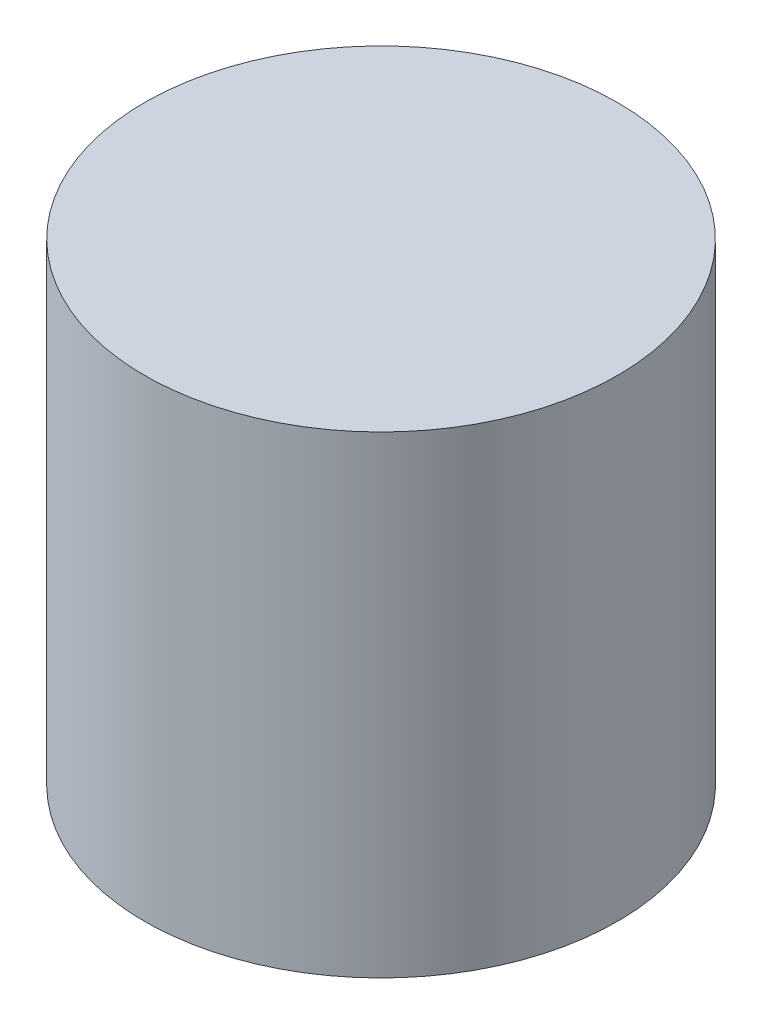
ISO-10303-21;
HEADER;
FILE_DESCRIPTION(('STEP AP214'),'2;1');
FILE_NAME('part.step','',(''),(''),'','','');
FILE_SCHEMA(('AUTOMOTIVE_DESIGN { 1 0 10303 214 1 1 1 1 }'));
ENDSEC;
DATA;
#1=APPLICATION_CONTEXT('core data for automotive mechanical design processes');
#2=APPLICATION_PROTOCOL_DEFINITION('international standard','automotive_design',2000,#1);
#3=PRODUCT_CONTEXT('',#1,'mechanical');
#4=PRODUCT('Part','Part','',(#3));
#5=PRODUCT_RELATED_PRODUCT_CATEGORY('part','',(#4));
#6=PRODUCT_DEFINITION_FORMATION('','',#4);
#7=PRODUCT_DEFINITION_CONTEXT('part definition',#1,'design');
#8=PRODUCT_DEFINITION('design','',#6,#7);
#9=PRODUCT_DEFINITION_SHAPE('','',#8);
#10=(LENGTH_UNIT() NAMED_UNIT(*) SI_UNIT(.MILLI.,.METRE.));
#11=(NAMED_UNIT(*) PLANE_ANGLE_UNIT() SI_UNIT($,.RADIAN.));
#12=(NAMED_UNIT(*) SI_UNIT($,.STERADIAN.) SOLID_ANGLE_UNIT());
#13=UNCERTAINTY_MEASURE_WITH_UNIT(LENGTH_MEASURE(1.E-05),#10,'distance_accuracy_value','');
#14=(GEOMETRIC_REPRESENTATION_CONTEXT(3) GLOBAL_UNCERTAINTY_ASSIGNED_CONTEXT((#13)) GLOBAL_UNIT_ASSIGNED_CONTEXT((#10,
#11,#12)) REPRESENTATION_CONTEXT('',''));
#15=CARTESIAN_POINT('',(0.,0.,0.));
#16=DIRECTION('',(0.,0.,1.));
#17=DIRECTION('',(1.,0.,0.));
#18=AXIS2_PLACEMENT_3D('',#15,#16,#17);
#19=CARTESIAN_POINT('',(0.,57.,0.));
#20=DIRECTION('',(0.,1.,0.));
#21=DIRECTION('',(0.,0.,1.));
#22=AXIS2_PLACEMENT_3D('',#19,#20,#21);
#23=PLANE('',#22);
#24=CARTESIAN_POINT('',(0.,57.,0.));
#25=DIRECTION('',(0.,-1.,0.));
#26=DIRECTION('',(0.,0.,-1.));
#27=AXIS2_PLACEMENT_3D('',#24,#25,#26);
#28=CIRCLE('',#27,28.5);
#29=CARTESIAN_POINT('',(0.,57.,-28.5));
#30=VERTEX_POINT('',#29);
#31=EDGE_CURVE('E18',#30,#30,#28,.T.);
#32=ORIENTED_EDGE('',*,*,#31,.F.);
#33=EDGE_LOOP('',(#32));
#34=FACE_BOUND('',#33,.T.);
#35=ADVANCED_FACE('F15',(#34),#23,.T.);
#36=CARTESIAN_POINT('',(0.,0.,0.));
#37=DIRECTION('',(0.,1.,0.));
#38=DIRECTION('',(0.,0.,1.));
#39=AXIS2_PLACEMENT_3D('',#36,#37,#38);
#40=PLANE('',#39);
#41=CARTESIAN_POINT('',(0.,0.,0.));
#42=DIRECTION('',(0.,-1.,0.));
#43=DIRECTION('',(0.,0.,-1.));
#44=AXIS2_PLACEMENT_3D('',#41,#42,#43);
#45=CIRCLE('',#44,28.5);
#46=CARTESIAN_POINT('',(0.,0.,-28.5));
#47=VERTEX_POINT('',#46);
#48=EDGE_CURVE('E10',#47,#47,#45,.F.);
#49=ORIENTED_EDGE('',*,*,#48,.F.);
#50=EDGE_LOOP('',(#49));
#51=FACE_BOUND('',#50,.T.);
#52=ADVANCED_FACE('F30',(#51),#40,.F.);
#53=CARTESIAN_POINT('',(0.,57.,0.));
#54=DIRECTION('',(0.,-1.,0.));
#55=DIRECTION('',(0.,0.,-1.));
#56=AXIS2_PLACEMENT_3D('',#53,#54,#55);
#57=CYLINDRICAL_SURFACE('',#56,28.5);
#58=ORIENTED_EDGE('',*,*,#31,.T.);
#59=EDGE_LOOP('',(#58));
#60=FACE_BOUND('',#59,.T.);
#61=ORIENTED_EDGE('',*,*,#48,.T.);
#62=EDGE_LOOP('',(#61));
#63=FACE_BOUND('',#62,.T.);
#64=ADVANCED_FACE('F27',(#60,#63),#57,.T.);
#65=CLOSED_SHELL('',(#35,#52,#64));
#66=MANIFOLD_SOLID_BREP('B1',#65);
#67=ADVANCED_BREP_SHAPE_REPRESENTATION('',(#18,#66),#14);
#68=SHAPE_DEFINITION_REPRESENTATION(#9,#67);
ENDSEC;
END-ISO-10303-21;
